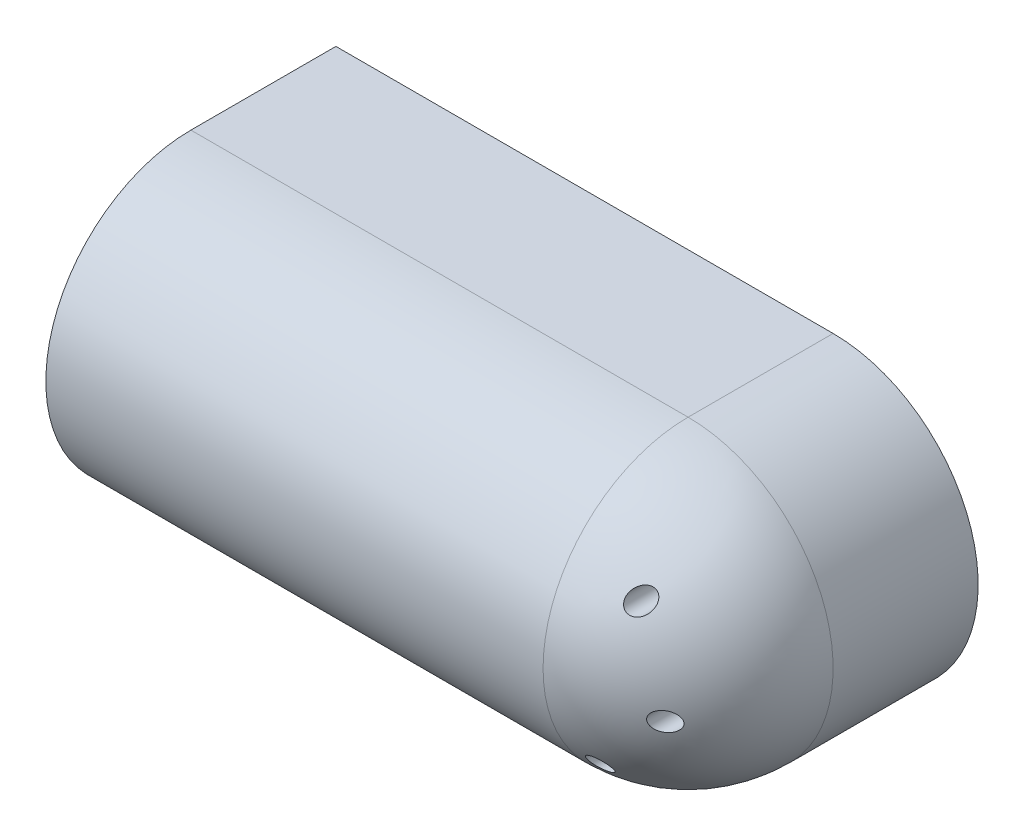
ISO-10303-21;
HEADER;
FILE_DESCRIPTION(('STEP AP214'),'2;1');
FILE_NAME('part.step','',(''),(''),'','','');
FILE_SCHEMA(('AUTOMOTIVE_DESIGN { 1 0 10303 214 1 1 1 1 }'));
ENDSEC;
DATA;
#1=APPLICATION_CONTEXT('core data for automotive mechanical design processes');
#2=APPLICATION_PROTOCOL_DEFINITION('international standard','automotive_design',2000,#1);
#3=PRODUCT_CONTEXT('',#1,'mechanical');
#4=PRODUCT('Part','Part','',(#3));
#5=PRODUCT_RELATED_PRODUCT_CATEGORY('part','',(#4));
#6=PRODUCT_DEFINITION_FORMATION('','',#4);
#7=PRODUCT_DEFINITION_CONTEXT('part definition',#1,'design');
#8=PRODUCT_DEFINITION('design','',#6,#7);
#9=PRODUCT_DEFINITION_SHAPE('','',#8);
#10=(LENGTH_UNIT() NAMED_UNIT(*) SI_UNIT(.MILLI.,.METRE.));
#11=(NAMED_UNIT(*) PLANE_ANGLE_UNIT() SI_UNIT($,.RADIAN.));
#12=(NAMED_UNIT(*) SI_UNIT($,.STERADIAN.) SOLID_ANGLE_UNIT());
#13=UNCERTAINTY_MEASURE_WITH_UNIT(LENGTH_MEASURE(1.E-05),#10,'distance_accuracy_value','');
#14=(GEOMETRIC_REPRESENTATION_CONTEXT(3) GLOBAL_UNCERTAINTY_ASSIGNED_CONTEXT((#13)) GLOBAL_UNIT_ASSIGNED_CONTEXT((#10,
#11,#12)) REPRESENTATION_CONTEXT('',''));
#15=CARTESIAN_POINT('',(0.,0.,0.));
#16=DIRECTION('',(0.,0.,1.));
#17=DIRECTION('',(1.,0.,0.));
#18=AXIS2_PLACEMENT_3D('',#15,#16,#17);
#19=CARTESIAN_POINT('',(0.,0.,-70.));
#20=DIRECTION('',(0.,0.,1.));
#21=DIRECTION('',(1.,0.,0.));
#22=AXIS2_PLACEMENT_3D('',#19,#20,#21);
#23=CYLINDRICAL_SURFACE('',#22,35.);
#24=DIRECTION('',(0.,0.,1.));
#25=VECTOR('',#24,1.);
#26=CARTESIAN_POINT('',(0.,35.,-70.));
#27=LINE('',#26,#25);
#28=CARTESIAN_POINT('',(0.,35.,-70.));
#29=VERTEX_POINT('',#28);
#30=CARTESIAN_POINT('',(0.,35.,-35.));
#31=VERTEX_POINT('',#30);
#32=EDGE_CURVE('E205',#29,#31,#27,.T.);
#33=ORIENTED_EDGE('',*,*,#32,.T.);
#34=CARTESIAN_POINT('',(0.,0.,-35.));
#35=DIRECTION('',(0.,0.,1.));
#36=DIRECTION('',(1.,0.,0.));
#37=AXIS2_PLACEMENT_3D('',#34,#35,#36);
#38=CIRCLE('',#37,35.);
#39=CARTESIAN_POINT('',(0.,-35.,-35.));
#40=VERTEX_POINT('',#39);
#41=EDGE_CURVE('E12',#31,#40,#38,.F.);
#42=ORIENTED_EDGE('',*,*,#41,.T.);
#43=DIRECTION('',(0.,0.,1.));
#44=VECTOR('',#43,1.);
#45=CARTESIAN_POINT('',(0.,-35.,-70.));
#46=LINE('',#45,#44);
#47=CARTESIAN_POINT('',(0.,-35.,-70.));
#48=VERTEX_POINT('',#47);
#49=EDGE_CURVE('E217',#48,#40,#46,.T.);
#50=ORIENTED_EDGE('',*,*,#49,.F.);
#51=CARTESIAN_POINT('',(0.,0.,-70.));
#52=DIRECTION('',(0.,0.,-1.));
#53=DIRECTION('',(-1.,0.,0.));
#54=AXIS2_PLACEMENT_3D('',#51,#52,#53);
#55=CIRCLE('',#54,35.);
#56=EDGE_CURVE('E194',#29,#48,#55,.T.);
#57=ORIENTED_EDGE('',*,*,#56,.F.);
#58=EDGE_LOOP('',(#33,#42,#50,#57));
#59=FACE_BOUND('',#58,.T.);
#60=ADVANCED_FACE('F57',(#59),#23,.T.);
#61=CARTESIAN_POINT('',(-120.,-35.,-70.));
#62=DIRECTION('',(1.,0.,0.));
#63=DIRECTION('',(0.,0.,-1.));
#64=AXIS2_PLACEMENT_3D('',#61,#62,#63);
#65=PLANE('',#64);
#66=DIRECTION('',(0.,0.,1.));
#67=VECTOR('',#66,1.);
#68=CARTESIAN_POINT('',(-120.,-30.,-65.));
#69=LINE('',#68,#67);
#70=CARTESIAN_POINT('',(-120.,-30.,-65.));
#71=VERTEX_POINT('',#70);
#72=CARTESIAN_POINT('',(-120.,-30.,-35.));
#73=VERTEX_POINT('',#72);
#74=EDGE_CURVE('E169',#71,#73,#69,.T.);
#75=ORIENTED_EDGE('',*,*,#74,.F.);
#76=DIRECTION('',(0.,-1.,0.));
#77=VECTOR('',#76,1.);
#78=CARTESIAN_POINT('',(-120.,30.,-65.));
#79=LINE('',#78,#77);
#80=CARTESIAN_POINT('',(-120.,30.,-65.));
#81=VERTEX_POINT('',#80);
#82=EDGE_CURVE('E80',#81,#71,#79,.T.);
#83=ORIENTED_EDGE('',*,*,#82,.F.);
#84=DIRECTION('',(0.,0.,-1.));
#85=VECTOR('',#84,1.);
#86=CARTESIAN_POINT('',(-120.,30.,-35.));
#87=LINE('',#86,#85);
#88=CARTESIAN_POINT('',(-120.,30.,-35.));
#89=VERTEX_POINT('',#88);
#90=EDGE_CURVE('E153',#89,#81,#87,.T.);
#91=ORIENTED_EDGE('',*,*,#90,.F.);
#92=CARTESIAN_POINT('',(-120.,0.,-35.));
#93=DIRECTION('',(-1.,0.,0.));
#94=DIRECTION('',(0.,0.,1.));
#95=AXIS2_PLACEMENT_3D('',#92,#93,#94);
#96=CIRCLE('',#95,30.);
#97=EDGE_CURVE('E157',#73,#89,#96,.T.);
#98=ORIENTED_EDGE('',*,*,#97,.F.);
#99=EDGE_LOOP('',(#75,#83,#91,#98));
#100=FACE_BOUND('',#99,.T.);
#101=DIRECTION('',(0.,0.,1.));
#102=VECTOR('',#101,1.);
#103=CARTESIAN_POINT('',(-120.,-35.,-70.));
#104=LINE('',#103,#102);
#105=CARTESIAN_POINT('',(-120.,-35.,-70.));
#106=VERTEX_POINT('',#105);
#107=CARTESIAN_POINT('',(-120.,-35.,-35.));
#108=VERTEX_POINT('',#107);
#109=EDGE_CURVE('E213',#106,#108,#104,.T.);
#110=ORIENTED_EDGE('',*,*,#109,.T.);
#111=CARTESIAN_POINT('',(-120.,0.,-35.));
#112=DIRECTION('',(-1.,0.,0.));
#113=DIRECTION('',(0.,0.,1.));
#114=AXIS2_PLACEMENT_3D('',#111,#112,#113);
#115=CIRCLE('',#114,35.);
#116=CARTESIAN_POINT('',(-120.,35.,-35.));
#117=VERTEX_POINT('',#116);
#118=EDGE_CURVE('E187',#108,#117,#115,.T.);
#119=ORIENTED_EDGE('',*,*,#118,.T.);
#120=DIRECTION('',(0.,0.,1.));
#121=VECTOR('',#120,1.);
#122=CARTESIAN_POINT('',(-120.,35.,-70.));
#123=LINE('',#122,#121);
#124=CARTESIAN_POINT('',(-120.,35.,-70.));
#125=VERTEX_POINT('',#124);
#126=EDGE_CURVE('E209',#125,#117,#123,.T.);
#127=ORIENTED_EDGE('',*,*,#126,.F.);
#128=DIRECTION('',(0.,1.,0.));
#129=VECTOR('',#128,1.);
#130=CARTESIAN_POINT('',(-120.,-35.,-70.));
#131=LINE('',#130,#129);
#132=EDGE_CURVE('E200',#106,#125,#131,.T.);
#133=ORIENTED_EDGE('',*,*,#132,.F.);
#134=EDGE_LOOP('',(#110,#119,#127,#133));
#135=FACE_BOUND('',#134,.T.);
#136=ADVANCED_FACE('F270',(#100,#135),#65,.F.);
#137=CARTESIAN_POINT('',(0.,35.,-70.));
#138=DIRECTION('',(0.,-1.,0.));
#139=DIRECTION('',(0.,0.,-1.));
#140=AXIS2_PLACEMENT_3D('',#137,#138,#139);
#141=PLANE('',#140);
#142=DIRECTION('',(-1.,0.,0.));
#143=VECTOR('',#142,1.);
#144=CARTESIAN_POINT('',(35.,35.,-35.));
#145=LINE('',#144,#143);
#146=EDGE_CURVE('E191',#31,#117,#145,.T.);
#147=ORIENTED_EDGE('',*,*,#146,.F.);
#148=ORIENTED_EDGE('',*,*,#32,.F.);
#149=DIRECTION('',(1.,0.,0.));
#150=VECTOR('',#149,1.);
#151=CARTESIAN_POINT('',(0.,35.,-70.));
#152=LINE('',#151,#150);
#153=EDGE_CURVE('E88',#125,#29,#152,.T.);
#154=ORIENTED_EDGE('',*,*,#153,.F.);
#155=ORIENTED_EDGE('',*,*,#126,.T.);
#156=EDGE_LOOP('',(#147,#148,#154,#155));
#157=FACE_BOUND('',#156,.T.);
#158=ADVANCED_FACE('F267',(#157),#141,.F.);
#159=CARTESIAN_POINT('',(0.,-35.,-70.));
#160=DIRECTION('',(0.,1.,0.));
#161=DIRECTION('',(0.,0.,1.));
#162=AXIS2_PLACEMENT_3D('',#159,#160,#161);
#163=PLANE('',#162);
#164=ORIENTED_EDGE('',*,*,#49,.T.);
#165=DIRECTION('',(-1.,0.,0.));
#166=VECTOR('',#165,1.);
#167=CARTESIAN_POINT('',(35.,-35.,-35.));
#168=LINE('',#167,#166);
#169=EDGE_CURVE('E178',#40,#108,#168,.T.);
#170=ORIENTED_EDGE('',*,*,#169,.T.);
#171=ORIENTED_EDGE('',*,*,#109,.F.);
#172=DIRECTION('',(-1.,0.,0.));
#173=VECTOR('',#172,1.);
#174=CARTESIAN_POINT('',(0.,-35.,-70.));
#175=LINE('',#174,#173);
#176=EDGE_CURVE('E197',#48,#106,#175,.T.);
#177=ORIENTED_EDGE('',*,*,#176,.F.);
#178=EDGE_LOOP('',(#164,#170,#171,#177));
#179=FACE_BOUND('',#178,.T.);
#180=ADVANCED_FACE('F265',(#179),#163,.F.);
#181=CARTESIAN_POINT('',(0.,0.,-70.));
#182=DIRECTION('',(0.,0.,-1.));
#183=DIRECTION('',(-1.,0.,0.));
#184=AXIS2_PLACEMENT_3D('',#181,#182,#183);
#185=PLANE('',#184);
#186=CARTESIAN_POINT('',(15.0014862201565,17.2448713371146,-70.));
#187=DIRECTION('',(0.,0.,-1.));
#188=DIRECTION('',(-1.,0.,0.));
#189=AXIS2_PLACEMENT_3D('',#186,#187,#188);
#190=CIRCLE('',#189,2.5);
#191=CARTESIAN_POINT('',(12.5014862201565,17.2448713371146,-70.));
#192=VERTEX_POINT('',#191);
#193=EDGE_CURVE('E232',#192,#192,#190,.T.);
#194=ORIENTED_EDGE('',*,*,#193,.F.);
#195=EDGE_LOOP('',(#194));
#196=FACE_BOUND('',#195,.T.);
#197=CARTESIAN_POINT('',(21.5544566211452,-4.27973269928448,-70.));
#198=DIRECTION('',(0.,0.,-1.));
#199=DIRECTION('',(-1.,0.,0.));
#200=AXIS2_PLACEMENT_3D('',#197,#198,#199);
#201=CIRCLE('',#200,2.5);
#202=CARTESIAN_POINT('',(19.0544566211452,-4.27973269928448,-70.));
#203=VERTEX_POINT('',#202);
#204=EDGE_CURVE('E307',#203,#203,#201,.T.);
#205=ORIENTED_EDGE('',*,*,#204,.F.);
#206=EDGE_LOOP('',(#205));
#207=FACE_BOUND('',#206,.T.);
#208=CARTESIAN_POINT('',(6.19008791971696,-20.7170735549877,-70.));
#209=DIRECTION('',(0.,0.,-1.));
#210=DIRECTION('',(-1.,0.,0.));
#211=AXIS2_PLACEMENT_3D('',#208,#209,#210);
#212=CIRCLE('',#211,2.5);
#213=CARTESIAN_POINT('',(3.69008791971696,-20.7170735549877,-70.));
#214=VERTEX_POINT('',#213);
#215=EDGE_CURVE('E160',#214,#214,#212,.T.);
#216=ORIENTED_EDGE('',*,*,#215,.F.);
#217=EDGE_LOOP('',(#216));
#218=FACE_BOUND('',#217,.T.);
#219=ORIENTED_EDGE('',*,*,#56,.T.);
#220=ORIENTED_EDGE('',*,*,#176,.T.);
#221=ORIENTED_EDGE('',*,*,#132,.T.);
#222=ORIENTED_EDGE('',*,*,#153,.T.);
#223=EDGE_LOOP('',(#219,#220,#221,#222));
#224=FACE_BOUND('',#223,.T.);
#225=ADVANCED_FACE('F261',(#196,#207,#218,#224),#185,.T.);
#226=CARTESIAN_POINT('',(35.,0.,-35.));
#227=DIRECTION('',(-1.,0.,0.));
#228=DIRECTION('',(0.,0.,1.));
#229=AXIS2_PLACEMENT_3D('',#226,#227,#228);
#230=CYLINDRICAL_SURFACE('',#229,35.);
#231=ORIENTED_EDGE('',*,*,#169,.F.);
#232=CARTESIAN_POINT('',(0.,0.,-35.));
#233=DIRECTION('',(-1.,0.,0.));
#234=DIRECTION('',(0.,0.,1.));
#235=AXIS2_PLACEMENT_3D('',#232,#233,#234);
#236=CIRCLE('',#235,35.);
#237=EDGE_CURVE('E72',#40,#31,#236,.T.);
#238=ORIENTED_EDGE('',*,*,#237,.T.);
#239=ORIENTED_EDGE('',*,*,#146,.T.);
#240=ORIENTED_EDGE('',*,*,#118,.F.);
#241=EDGE_LOOP('',(#231,#238,#239,#240));
#242=FACE_BOUND('',#241,.T.);
#243=ADVANCED_FACE('F258',(#242),#230,.T.);
#244=CARTESIAN_POINT('',(0.,0.,-35.));
#245=DIRECTION('',(0.,0.,1.));
#246=DIRECTION('',(1.,0.,0.));
#247=AXIS2_PLACEMENT_3D('',#244,#245,#246);
#248=SPHERICAL_SURFACE('',#247,35.);
#249=CARTESIAN_POINT('',(16.7177216384352,19.0627096107371,-10.8726112992619));
#250=CARTESIAN_POINT('',(16.6369406019022,19.1389673469574,-10.8768891254063));
#251=CARTESIAN_POINT('',(16.5506841182577,19.2101310633771,-10.8741200688737));
#252=CARTESIAN_POINT('',(16.3703706708573,19.3397588596841,-10.8546655407115));
#253=CARTESIAN_POINT('',(16.2762939882982,19.3981894027401,-10.8379438660747));
#254=CARTESIAN_POINT('',(16.0843496453957,19.500792091149,-10.7920449396665));
#255=CARTESIAN_POINT('',(15.9865084851713,19.5450486942783,-10.7629439674421));
#256=CARTESIAN_POINT('',(15.7894020264096,19.619807946329,-10.6942345705147));
#257=CARTESIAN_POINT('',(15.690136652396,19.6503098635207,-10.6546255869785));
#258=CARTESIAN_POINT('',(15.4570957822486,19.7068728384462,-10.5512803834504));
#259=CARTESIAN_POINT('',(15.323589173151,19.7275060898687,-10.4839718364856));
#260=CARTESIAN_POINT('',(15.0612335294674,19.7476343268948,-10.3380265896305));
#261=CARTESIAN_POINT('',(14.9323948755719,19.7470847863273,-10.2593663741257));
#262=CARTESIAN_POINT('',(14.6393009521085,19.7242021778325,-10.0663462194846));
#263=CARTESIAN_POINT('',(14.4776748458659,19.6946186810416,-9.9488661594846));
#264=CARTESIAN_POINT('',(14.1691391753418,19.6076944498036,-9.70544654595891));
#265=CARTESIAN_POINT('',(14.0222411128686,19.5503322223553,-9.57950050721264));
#266=CARTESIAN_POINT('',(13.7418810707494,19.4101552964685,-9.32026516252962));
#267=CARTESIAN_POINT('',(13.6087689219823,19.326827999887,-9.18687689043501));
#268=CARTESIAN_POINT('',(13.3613212174082,19.1380404529562,-8.91834367157225));
#269=CARTESIAN_POINT('',(13.2469934818765,19.0325710258665,-8.78319801831562));
#270=CARTESIAN_POINT('',(13.0204760878154,18.7808451568048,-8.48951340697672));
#271=CARTESIAN_POINT('',(12.9123810782656,18.6306639005053,-8.33114562767595));
#272=CARTESIAN_POINT('',(12.7300267336322,18.3056020560566,-8.0201900926389));
#273=CARTESIAN_POINT('',(12.6557478821296,18.1307357909828,-7.86759904970232));
#274=CARTESIAN_POINT('',(12.5614474505212,17.8077255770526,-7.61154373178317));
#275=CARTESIAN_POINT('',(12.5323955742453,17.6642332865036,-7.50551825218881));
#276=CARTESIAN_POINT('',(12.5000935539086,17.3679997720518,-7.30284166203909));
#277=CARTESIAN_POINT('',(12.4968043282934,17.2152729117035,-7.20617657203216));
#278=CARTESIAN_POINT('',(12.5174847373755,16.9366938489423,-7.04501269142688));
#279=CARTESIAN_POINT('',(12.5359091544219,16.8118843996288,-6.97801096916109));
#280=CARTESIAN_POINT('',(12.5932728140751,16.5615399760366,-6.85492787236613));
#281=CARTESIAN_POINT('',(12.6321895720176,16.4360059458008,-6.79883462100135));
#282=CARTESIAN_POINT('',(12.7239115259766,16.2079206475439,-6.70831007330224));
#283=CARTESIAN_POINT('',(12.7735172570847,16.1048934930202,-6.67185155439177));
#284=CARTESIAN_POINT('',(12.8882510095789,15.9041342947453,-6.61046346509561));
#285=CARTESIAN_POINT('',(12.9533712600021,15.8063996300569,-6.58552814125709));
#286=CARTESIAN_POINT('',(13.0985440644407,15.6191713956896,-6.54856648528016));
#287=CARTESIAN_POINT('',(13.1786645337786,15.5297181889584,-6.53660061655147));
#288=CARTESIAN_POINT('',(13.3514188562753,15.3629365449163,-6.52660496354298));
#289=CARTESIAN_POINT('',(13.4440496561521,15.2856051590625,-6.52857178484638));
#290=CARTESIAN_POINT('',(13.6307352209359,15.1512611733276,-6.5455704451095));
#291=CARTESIAN_POINT('',(13.7240786765665,15.0931157731124,-6.55954074924815));
#292=CARTESIAN_POINT('',(13.9157572894083,14.9903148372133,-6.59833868403325));
#293=CARTESIAN_POINT('',(14.0140926960396,14.9456599763532,-6.62316685766018));
#294=CARTESIAN_POINT('',(14.2167134685325,14.8686744297755,-6.68356137531326));
#295=CARTESIAN_POINT('',(14.3210845340365,14.8368588221616,-6.71948987412275));
#296=CARTESIAN_POINT('',(14.5297469765997,14.7874371816929,-6.80015418283752));
#297=CARTESIAN_POINT('',(14.6340382783809,14.7698389647261,-6.8448948203544));
#298=CARTESIAN_POINT('',(14.8825289152753,14.7434416237608,-6.96132738217126));
#299=CARTESIAN_POINT('',(15.025755593774,14.7411076805848,-7.03658993466549));
#300=CARTESIAN_POINT('',(15.3045253410427,14.75935955244,-7.19786073741987));
#301=CARTESIAN_POINT('',(15.4400527830374,14.7799903455497,-7.28388978126093));
#302=CARTESIAN_POINT('',(15.7372177599257,14.8494649415152,-7.48862480715347));
#303=CARTESIAN_POINT('',(15.8957032052223,14.9045358614514,-7.60978574983163));
#304=CARTESIAN_POINT('',(16.1935136188976,15.0412454991207,-7.86010933091103));
#305=CARTESIAN_POINT('',(16.3328277707491,15.1228991282082,-7.98927642729875));
#306=CARTESIAN_POINT('',(16.5925691076617,15.3098199282357,-8.25416248472683));
#307=CARTESIAN_POINT('',(16.7126845339988,15.4154202739588,-8.38995032329931));
#308=CARTESIAN_POINT('',(16.929996636402,15.6461274849129,-8.66337598866163));
#309=CARTESIAN_POINT('',(17.0271787213521,15.7712466851984,-8.80101493466116));
#310=CARTESIAN_POINT('',(17.2103317814023,16.0596739675542,-9.09729142271478));
#311=CARTESIAN_POINT('',(17.2920271611415,16.2258894808689,-9.25576847332662));
#312=CARTESIAN_POINT('',(17.4179517101338,16.5774100391062,-9.56649312815749));
#313=CARTESIAN_POINT('',(17.4622136241054,16.762698240795,-9.71874606568845));
#314=CARTESIAN_POINT('',(17.5003056855584,17.0895586449526,-9.96572623504253));
#315=CARTESIAN_POINT('',(17.5053849334559,17.2272723957385,-10.0638582017625));
#316=CARTESIAN_POINT('',(17.491555354038,17.5080009806501,-10.2503797087317));
#317=CARTESIAN_POINT('',(17.4726889647809,17.6510060016036,-10.3387861837088));
#318=CARTESIAN_POINT('',(17.4151852771862,17.9059214663727,-10.4825332997744));
#319=CARTESIAN_POINT('',(17.3820915044804,18.0174209103658,-10.5408028648444));
#320=CARTESIAN_POINT('',(17.2982629848717,18.2392675004891,-10.6460272108515));
#321=CARTESIAN_POINT('',(17.2475404960775,18.3496153925743,-10.6929898157608));
#322=CARTESIAN_POINT('',(17.1375350514195,18.5479416373851,-10.765921403382));
#323=CARTESIAN_POINT('',(17.0809899410568,18.6366371835477,-10.7940634267483));
#324=CARTESIAN_POINT('',(16.9555054255901,18.8078801321939,-10.838332679064));
#325=CARTESIAN_POINT('',(16.8866036211337,18.8904451406456,-10.8544956143251));
#326=CARTESIAN_POINT('',(16.7970179055674,18.9845737961518,-10.866068532906));
#327=CARTESIAN_POINT('',(16.7814702081705,19.0004772253129,-10.867768024523));
#328=CARTESIAN_POINT('',(16.7499291384741,19.0318920968737,-10.8706101461072));
#329=CARTESIAN_POINT('',(16.7339356828557,19.0474034649441,-10.8717526712211));
#330=CARTESIAN_POINT('',(16.7177216384352,19.0627096107371,-10.8726112992619));
#331=B_SPLINE_CURVE_WITH_KNOTS('',3,(#249,#250,#251,#252,#253,#254,#255,#256,#257,#258,#259,
#260,#261,#262,#263,#264,#265,#266,#267,#268,#269,#270,#271,#272,#273,#274,#275,#276,#277,#278,
#279,#280,#281,#282,#283,#284,#285,#286,#287,#288,#289,#290,#291,#292,#293,#294,#295,#296,#297,
#298,#299,#300,#301,#302,#303,#304,#305,#306,#307,#308,#309,#310,#311,#312,#313,#314,#315,#316,
#317,#318,#319,#320,#321,#322,#323,#324,#325,#326,#327,#328,#329,#330),.UNSPECIFIED.,.T.,.F.,(4,
2,2,2,2,2,2,2,2,2,2,2,2,2,2,2,2,2,2,2,2,2,2,2,2,2,2,2,2,2,2,2,2,2,2,2,2,2,2,2,4),(0.,
0.333412729087982,0.667693267732511,0.999943189629446,1.33221078466303,1.78252625151649,
2.23378833176974,2.83653127278071,3.43974131587568,4.05570762185967,4.67192971901068,
5.39915113544319,6.12595231471861,6.66631644424822,7.20586069043455,7.63281126519433,
8.05929435318566,8.41784734901343,8.77622112783298,9.13625854754588,9.49620825447466,
9.82726121831297,10.1583307393454,10.5016064138716,10.8450706730731,11.3278613329314,
11.8115992391924,12.4291911805736,13.0471301537766,13.6742606917862,14.301789166184,
15.0296325291327,15.7568385546304,16.2627155352197,16.7676972174319,17.1565653385638,
17.5451635998749,17.8705002224607,18.1948631639044,18.2617718333065,18.3286930939366),.UNSPECIFIED.);
#332=CARTESIAN_POINT('',(16.7177216384352,19.0627096107371,-10.8726112992619));
#333=VERTEX_POINT('',#332);
#334=EDGE_CURVE('E62',#333,#333,#331,.T.);
#335=ORIENTED_EDGE('',*,*,#334,.F.);
#336=EDGE_LOOP('',(#335));
#337=FACE_BOUND('',#336,.T.);
#338=CARTESIAN_POINT('',(23.3832848355082,-5.98425238598531,-9.65417758915049));
#339=CARTESIAN_POINT('',(23.4568986323955,-5.90526464716925,-9.70344273240122));
#340=CARTESIAN_POINT('',(23.5267315165937,-5.82007060811399,-9.74858865868272));
#341=CARTESIAN_POINT('',(23.6564030840938,-5.6377944034859,-9.82850842365398));
#342=CARTESIAN_POINT('',(23.7162342347565,-5.5407033724095,-9.86327446025336));
#343=CARTESIAN_POINT('',(23.8235225321215,-5.33557578116255,-9.92041266444247));
#344=CARTESIAN_POINT('',(23.8708970502679,-5.22747242045602,-9.94270312568407));
#345=CARTESIAN_POINT('',(23.9502158351547,-5.00387053783963,-9.97276050131583));
#346=CARTESIAN_POINT('',(23.9821742031761,-4.88837888402702,-9.9805407071042));
#347=CARTESIAN_POINT('',(24.0271386488118,-4.66415600588351,-9.9809235289508));
#348=CARTESIAN_POINT('',(24.0415441081609,-4.55570328478754,-9.97477989581733));
#349=CARTESIAN_POINT('',(24.0561021936478,-4.33923560368691,-9.95031139194295));
#350=CARTESIAN_POINT('',(24.0562529479992,-4.23122070303458,-9.93198492179091));
#351=CARTESIAN_POINT('',(24.0431364410614,-4.01978227454172,-9.88465437170701));
#352=CARTESIAN_POINT('',(24.0300242417079,-3.91632010956318,-9.85577614900134));
#353=CARTESIAN_POINT('',(23.991933816198,-3.71471077003327,-9.78889730039799));
#354=CARTESIAN_POINT('',(23.9669503136153,-3.61656598052085,-9.75089262179236));
#355=CARTESIAN_POINT('',(23.8942424483441,-3.38807150340859,-9.65026146562968));
#356=CARTESIAN_POINT('',(23.8413959101901,-3.26097674267265,-9.58392334041818));
#357=CARTESIAN_POINT('',(23.7191022699311,-3.02178230073832,-9.44033780227928));
#358=CARTESIAN_POINT('',(23.6496207834094,-2.90971443866367,-9.36306793059073));
#359=CARTESIAN_POINT('',(23.4750665363999,-2.67065885325035,-9.17699374410195));
#360=CARTESIAN_POINT('',(23.3655339471925,-2.54895490587737,-9.06559271205467));
#361=CARTESIAN_POINT('',(23.1299483988107,-2.33203937504111,-8.83502133660282));
#362=CARTESIAN_POINT('',(23.0038854041201,-2.23684399533249,-8.71584629590742));
#363=CARTESIAN_POINT('',(22.7372094122734,-2.07154791464179,-8.47137103418457));
#364=CARTESIAN_POINT('',(22.5963962756143,-2.00187205973618,-8.34600340458545));
#365=CARTESIAN_POINT('',(22.3053512353298,-1.89007308785599,-8.09388239137973));
#366=CARTESIAN_POINT('',(22.1551153256026,-1.84796177818936,-7.96712843754443));
#367=CARTESIAN_POINT('',(21.825305908272,-1.78798623210344,-7.69592898624227));
#368=CARTESIAN_POINT('',(21.644712286029,-1.77470706992499,-7.55168200173921));
#369=CARTESIAN_POINT('',(21.2803028597333,-1.7881413183448,-7.26907202417079));
#370=CARTESIAN_POINT('',(21.0964891381724,-1.81482976099172,-7.13070541312754));
#371=CARTESIAN_POINT('',(20.7768126610049,-1.8994954998487,-6.89757386565656));
#372=CARTESIAN_POINT('',(20.6402230698996,-1.94821798973334,-6.80042492951446));
#373=CARTESIAN_POINT('',(20.3727349058833,-2.07175715981126,-6.61532745509851));
#374=CARTESIAN_POINT('',(20.2418277477238,-2.1465328167203,-6.52736473358722));
#375=CARTESIAN_POINT('',(20.0147996178292,-2.30619144527171,-6.37991866188575));
#376=CARTESIAN_POINT('',(19.9168240022822,-2.38638093955888,-6.31820943176552));
#377=CARTESIAN_POINT('',(19.7311141895346,-2.56453187814992,-6.20545231101419));
#378=CARTESIAN_POINT('',(19.6433777083929,-2.66248934663013,-6.1544020407833));
#379=CARTESIAN_POINT('',(19.5222087129668,-2.82216210555186,-6.08765286772663));
#380=CARTESIAN_POINT('',(19.4833926683808,-2.87781654764309,-6.06696330485625));
#381=CARTESIAN_POINT('',(19.4099401039895,-2.99299094950146,-6.02930378264428));
#382=CARTESIAN_POINT('',(19.3753013088458,-3.05250877746389,-6.01233179419756));
#383=CARTESIAN_POINT('',(19.3107338320907,-3.17497263644687,-5.98241706148069));
#384=CARTESIAN_POINT('',(19.2808022691514,-3.23791653832978,-5.96947184761179));
#385=CARTESIAN_POINT('',(19.2261002770415,-3.36668376266609,-5.94784819387717));
#386=CARTESIAN_POINT('',(19.2013288718525,-3.43250653773986,-5.93916894670196));
#387=CARTESIAN_POINT('',(19.1418226039918,-3.6137036292263,-5.9217209824732));
#388=CARTESIAN_POINT('',(19.1123681601358,-3.73130895405418,-5.91719941433649));
#389=CARTESIAN_POINT('',(19.0708751797368,-3.96921756486335,-5.92145758569896));
#390=CARTESIAN_POINT('',(19.0588303247366,-4.08951985592975,-5.93023249714093));
#391=CARTESIAN_POINT('',(19.0522981530589,-4.32091356577137,-5.95947098807926));
#392=CARTESIAN_POINT('',(19.0566876873504,-4.43208170149135,-5.97911133959109));
#393=CARTESIAN_POINT('',(19.0796773312024,-4.6506084725652,-6.02845465043839));
#394=CARTESIAN_POINT('',(19.0982793672219,-4.75796658941867,-6.0581589736091));
#395=CARTESIAN_POINT('',(19.1499583106728,-4.97362690097754,-6.12862058124848));
#396=CARTESIAN_POINT('',(19.183914526774,-5.08151823091501,-6.16998093135641));
#397=CARTESIAN_POINT('',(19.2644011129965,-5.28870115549737,-6.26105543055088));
#398=CARTESIAN_POINT('',(19.3109373867782,-5.3879886835254,-6.3107734976542));
#399=CARTESIAN_POINT('',(19.4228377344136,-5.59190206158757,-6.42547684504495));
#400=CARTESIAN_POINT('',(19.4900187728895,-5.694867736346,-6.49163271286428));
#401=CARTESIAN_POINT('',(19.6357739566113,-5.8869727229933,-6.63101401799006));
#402=CARTESIAN_POINT('',(19.714355203027,-5.9761033448915,-6.70424385208726));
#403=CARTESIAN_POINT('',(19.8977361594636,-6.15727021712846,-6.87178707506295));
#404=CARTESIAN_POINT('',(20.0045955939684,-6.24608678551926,-6.96732639419381));
#405=CARTESIAN_POINT('',(20.2279785171888,-6.40320418773942,-7.16376079794539));
#406=CARTESIAN_POINT('',(20.3445079721231,-6.47149223395292,-7.26465917497706));
#407=CARTESIAN_POINT('',(20.6089092556272,-6.59957704126014,-7.49074000389133));
#408=CARTESIAN_POINT('',(20.7583372496213,-6.6548263098106,-7.61668973852665));
#409=CARTESIAN_POINT('',(21.0633685871883,-6.73610854882345,-7.87067150087439));
#410=CARTESIAN_POINT('',(21.2189777391934,-6.76211333202976,-7.99870541707863));
#411=CARTESIAN_POINT('',(21.5534699482028,-6.78606102827063,-8.27080615944806));
#412=CARTESIAN_POINT('',(21.7327373393155,-6.77989328378675,-8.41478197657809));
#413=CARTESIAN_POINT('',(22.0899490812281,-6.72836265945759,-8.69760911285431));
#414=CARTESIAN_POINT('',(22.2678935881394,-6.68300448091101,-8.83646104458049));
#415=CARTESIAN_POINT('',(22.5724406175342,-6.56734296382467,-9.06962380590164));
#416=CARTESIAN_POINT('',(22.7006911913423,-6.50619367715025,-9.16634801310171));
#417=CARTESIAN_POINT('',(22.9493622899713,-6.35938447296584,-9.35016417461938));
#418=CARTESIAN_POINT('',(23.0698120819151,-6.27382357245917,-9.43729310897621));
#419=CARTESIAN_POINT('',(23.2529358645031,-6.11641844255716,-9.56575126461416));
#420=CARTESIAN_POINT('',(23.3195284147878,-6.0526631421296,-9.61150937568021));
#421=CARTESIAN_POINT('',(23.3832848355082,-5.98425238598531,-9.65417758915049));
#422=B_SPLINE_CURVE_WITH_KNOTS('',3,(#338,#339,#340,#341,#342,#343,#344,#345,#346,#347,#348,
#349,#350,#351,#352,#353,#354,#355,#356,#357,#358,#359,#360,#361,#362,#363,#364,#365,#366,#367,
#368,#369,#370,#371,#372,#373,#374,#375,#376,#377,#378,#379,#380,#381,#382,#383,#384,#385,#386,
#387,#388,#389,#390,#391,#392,#393,#394,#395,#396,#397,#398,#399,#400,#401,#402,#403,#404,#405,
#406,#407,#408,#409,#410,#411,#412,#413,#414,#415,#416,#417,#418,#419,#420,#421),.UNSPECIFIED.,
.T.,.F.,(4,2,2,2,2,2,2,2,2,2,2,2,2,2,2,2,2,2,2,2,2,2,2,2,2,2,2,2,2,2,2,2,2,2,2,2,2,2,2,2,2,4),
(0.,0.355800218213375,0.711867205821224,1.07023968443908,1.42828373222738,1.75538019539802,
2.08251960957167,2.40587802809755,2.72938030404933,3.18525535595666,3.64208096235663,
4.23306548229608,4.82441046123476,5.42519512807445,6.02623697367132,6.71744338767872,
7.40821818186396,7.92995460719071,8.45087319224336,8.8718244875438,9.29268170526008,
9.50522362412155,9.71764924389132,9.92994432615662,10.1421992173236,10.5040312848711,
10.865731999805,11.2031791805007,11.5406721091954,11.9005799899784,12.2606570650265,
12.677971027087,13.0955460583643,13.5995835497114,14.1039343683019,14.7108031338142,
15.3182563289438,16.0050817804666,16.6918248515962,17.2056890589722,17.7174978898591,
18.0256540964947),.UNSPECIFIED.);
#423=CARTESIAN_POINT('',(23.3832848355082,-5.98425238598531,-9.65417758915049));
#424=VERTEX_POINT('',#423);
#425=EDGE_CURVE('E231',#424,#424,#422,.T.);
#426=ORIENTED_EDGE('',*,*,#425,.F.);
#427=EDGE_LOOP('',(#426));
#428=FACE_BOUND('',#427,.T.);
#429=CARTESIAN_POINT('',(4.80477897625525,-22.7981596010634,-8.88184505379873));
#430=CARTESIAN_POINT('',(4.91176072089829,-22.8693727276767,-8.9636878948358));
#431=CARTESIAN_POINT('',(5.02616797550248,-22.933634662253,-9.04216318083688));
#432=CARTESIAN_POINT('',(5.26903001503907,-23.0450550380967,-9.1894198857896));
#433=CARTESIAN_POINT('',(5.39749459308957,-23.092201455737,-9.25819446935212));
#434=CARTESIAN_POINT('',(5.64191239519249,-23.1588936520624,-9.37091429470456));
#435=CARTESIAN_POINT('',(5.75587203481312,-23.181905742666,-9.41710028176519));
#436=CARTESIAN_POINT('',(5.98981443609058,-23.2118203108313,-9.49805820671494));
#437=CARTESIAN_POINT('',(6.10979121943476,-23.218738466794,-9.53284122474702));
#438=CARTESIAN_POINT('',(6.3536501413465,-23.2147153404951,-9.58890214405));
#439=CARTESIAN_POINT('',(6.4775551468135,-23.2036369220931,-9.6100746123182));
#440=CARTESIAN_POINT('',(6.72392913392064,-23.1625941781686,-9.636665134092));
#441=CARTESIAN_POINT('',(6.84639898255503,-23.1326419247916,-9.64209324563009));
#442=CARTESIAN_POINT('',(7.07006192614793,-23.0596631047217,-9.63706967355938));
#443=CARTESIAN_POINT('',(7.17199800525602,-23.0187454515604,-9.62852282320079));
#444=CARTESIAN_POINT('',(7.36826504407237,-22.9247279103159,-9.59965422390896));
#445=CARTESIAN_POINT('',(7.46259600336977,-22.8716280215747,-9.57933247433959));
#446=CARTESIAN_POINT('',(7.64182502393684,-22.755189868956,-9.5281341372396));
#447=CARTESIAN_POINT('',(7.72670037402694,-22.691827814954,-9.49723283378727));
#448=CARTESIAN_POINT('',(7.88567870423217,-22.5571406855465,-9.42650585842105));
#449=CARTESIAN_POINT('',(7.95977636106558,-22.485811705685,-9.386675800961));
#450=CARTESIAN_POINT('',(8.12506784218275,-22.3064838785372,-9.28175421900615));
#451=CARTESIAN_POINT('',(8.21071573755862,-22.195490707252,-9.21301793439587));
#452=CARTESIAN_POINT('',(8.36009850227372,-21.9660269459488,-9.06495122398831));
#453=CARTESIAN_POINT('',(8.42378804696279,-21.8475414801055,-8.98559934914417));
#454=CARTESIAN_POINT('',(8.54489303873601,-21.5732934094822,-8.79661854643302));
#455=CARTESIAN_POINT('',(8.5957607706963,-21.4162439838829,-8.6846662979931));
#456=CARTESIAN_POINT('',(8.66579752123782,-21.1005412916651,-8.4536124344029));
#457=CARTESIAN_POINT('',(8.68495010637259,-20.9418872364033,-8.33450714595028));
#458=CARTESIAN_POINT('',(8.69347607886852,-20.6245379598209,-8.09103432962632));
#459=CARTESIAN_POINT('',(8.68244893797369,-20.4658704041057,-7.96661780819619));
#460=CARTESIAN_POINT('',(8.63097337479626,-20.1539799282141,-7.71696508861364));
#461=CARTESIAN_POINT('',(8.59051096214236,-20.0007596334161,-7.59172852876292));
#462=CARTESIAN_POINT('',(8.47383112236643,-19.6843903309956,-7.327442262841));
#463=CARTESIAN_POINT('',(8.39373949056747,-19.522435725196,-7.188648339945));
#464=CARTESIAN_POINT('',(8.19731510325598,-19.2156957660362,-6.91775563827072));
#465=CARTESIAN_POINT('',(8.08101394769902,-19.0708955935738,-6.78565113807491));
#466=CARTESIAN_POINT('',(7.84761095506466,-18.8403424884571,-6.56613315737185));
#467=CARTESIAN_POINT('',(7.73853589377855,-18.7490143247135,-6.47601333477139));
#468=CARTESIAN_POINT('',(7.50152397935219,-18.5837837990943,-6.30508454709981));
#469=CARTESIAN_POINT('',(7.3736159676694,-18.5098552329058,-6.22426167563006));
#470=CARTESIAN_POINT('',(7.12540104936373,-18.3953581599834,-6.08878460263935));
#471=CARTESIAN_POINT('',(7.00790250290658,-18.3511745215479,-6.03204121416336));
#472=CARTESIAN_POINT('',(6.76312574619846,-18.2803139905003,-5.92924041273304));
#473=CARTESIAN_POINT('',(6.6358501726513,-18.2536323962612,-5.88318013209409));
#474=CARTESIAN_POINT('',(6.43960966816076,-18.2286683079435,-5.82377853451997));
#475=CARTESIAN_POINT('',(6.37299646327206,-18.2228650493382,-5.80553292487154));
#476=CARTESIAN_POINT('',(6.23864989267983,-18.2166427934938,-5.7726505647151));
#477=CARTESIAN_POINT('',(6.17091712952813,-18.2162209887123,-5.75801193632927));
#478=CARTESIAN_POINT('',(6.03494923464397,-18.220965424077,-5.7326018711905));
#479=CARTESIAN_POINT('',(5.96671435336081,-18.2261290441164,-5.72182862435398));
#480=CARTESIAN_POINT('',(5.83041542060173,-18.2421286910466,-5.70433842219638));
#481=CARTESIAN_POINT('',(5.76235134369378,-18.2529638160791,-5.69762082232933));
#482=CARTESIAN_POINT('',(5.57760808286329,-18.2903297632684,-5.68501366865913));
#483=CARTESIAN_POINT('',(5.46171021072718,-18.3225444086431,-5.68330818651327));
#484=CARTESIAN_POINT('',(5.23629506869443,-18.4030676643158,-5.69261739825622));
#485=CARTESIAN_POINT('',(5.12677603181099,-18.4513717925521,-5.70362855176562));
#486=CARTESIAN_POINT('',(4.92249396067067,-18.5593249958892,-5.73682455702196));
#487=CARTESIAN_POINT('',(4.82726588787118,-18.6182816194176,-5.75841982560675));
#488=CARTESIAN_POINT('',(4.64730515511058,-18.7467795033464,-5.81141064811355));
#489=CARTESIAN_POINT('',(4.56257431273081,-18.8163225921459,-5.84280789593157));
#490=CARTESIAN_POINT('',(4.39883631598202,-18.9692480084365,-5.91679507272862));
#491=CARTESIAN_POINT('',(4.32073806969763,-19.0532776550709,-5.96004890395925));
#492=CARTESIAN_POINT('',(4.17857766582961,-19.2282634103581,-6.05473534489468));
#493=CARTESIAN_POINT('',(4.11452227992819,-19.3192228322917,-6.1061718798848));
#494=CARTESIAN_POINT('',(3.99125192505925,-19.5207389867334,-6.22447602480168));
#495=CARTESIAN_POINT('',(3.9344620119517,-19.6320986730791,-6.29249538535033));
#496=CARTESIAN_POINT('',(3.83907315509604,-19.8581189771414,-6.4353921951667));
#497=CARTESIAN_POINT('',(3.8004859564366,-19.9727816756056,-6.51027403526213));
#498=CARTESIAN_POINT('',(3.73454399733868,-20.2264010508944,-6.68083718432868));
#499=CARTESIAN_POINT('',(3.71103272425907,-20.365586395886,-6.77766449937955));
#500=CARTESIAN_POINT('',(3.68734527694271,-20.6423092393901,-6.97630009755919));
#501=CARTESIAN_POINT('',(3.68718008076915,-20.7798459322595,-7.07811070147869));
#502=CARTESIAN_POINT('',(3.71080292885734,-21.0767026774942,-7.304443927526));
#503=CARTESIAN_POINT('',(3.73915715004452,-21.2351849272988,-7.4296004037423));
#504=CARTESIAN_POINT('',(3.82508335959627,-21.5431225154107,-7.68143277860725));
#505=CARTESIAN_POINT('',(3.88270612362261,-21.6925616596397,-7.80811094296805));
#506=CARTESIAN_POINT('',(4.0339779259676,-21.9949321514428,-8.07415144264569));
#507=CARTESIAN_POINT('',(4.13094875960789,-22.146367477751,-8.21333875994388));
#508=CARTESIAN_POINT('',(4.35829831388553,-22.4279507001238,-8.48503982868403));
#509=CARTESIAN_POINT('',(4.48854397775843,-22.5581800733586,-8.61757770094115));
#510=CARTESIAN_POINT('',(4.68927671531364,-22.7176724297179,-8.79074347798777));
#511=CARTESIAN_POINT('',(4.74590337642231,-22.7589686572316,-8.83680422581292));
#512=CARTESIAN_POINT('',(4.80477897625525,-22.7981596010634,-8.88184505379873));
#513=B_SPLINE_CURVE_WITH_KNOTS('',3,(#429,#430,#431,#432,#433,#434,#435,#436,#437,#438,#439,
#440,#441,#442,#443,#444,#445,#446,#447,#448,#449,#450,#451,#452,#453,#454,#455,#456,#457,#458,
#459,#460,#461,#462,#463,#464,#465,#466,#467,#468,#469,#470,#471,#472,#473,#474,#475,#476,#477,
#478,#479,#480,#481,#482,#483,#484,#485,#486,#487,#488,#489,#490,#491,#492,#493,#494,#495,#496,
#497,#498,#499,#500,#501,#502,#503,#504,#505,#506,#507,#508,#509,#510,#511,#512),.UNSPECIFIED.,
.T.,.F.,(4,2,2,2,2,2,2,2,2,2,2,2,2,2,2,2,2,2,2,2,2,2,2,2,2,2,2,2,2,2,2,2,2,2,2,2,2,2,2,2,2,4),
(0.,0.456902185360468,0.914124725585642,1.28792765499223,1.66136628001931,2.03766392576166,
2.41372112672067,2.74265015625969,3.07157920356864,3.40128199768937,3.73114708851037,
4.1970059793364,4.66382078086079,5.25907537684317,5.85463831215474,6.45814341146517,
7.06193553993835,7.74207626022088,8.42162507941446,8.92497269870377,9.42755734007603,
9.83925516260899,10.2508423441693,10.4585128481475,10.6660750045271,10.8735398363057,
11.080971687935,11.4398246772098,11.7985777839714,12.139294754732,12.4800706379702,
12.8464605102239,13.2130266745469,13.6383990857388,14.06404558935,14.5756730482633,
15.0875410897776,15.6968579626948,16.3072355197114,16.9862310028988,17.6625527469868,
17.9140011629557),.UNSPECIFIED.);
#514=CARTESIAN_POINT('',(4.80477897625525,-22.7981596010634,-8.88184505379873));
#515=VERTEX_POINT('',#514);
#516=EDGE_CURVE('E224',#515,#515,#513,.T.);
#517=ORIENTED_EDGE('',*,*,#516,.F.);
#518=EDGE_LOOP('',(#517));
#519=FACE_BOUND('',#518,.T.);
#520=ORIENTED_EDGE('',*,*,#237,.F.);
#521=ORIENTED_EDGE('',*,*,#41,.F.);
#522=EDGE_LOOP('',(#520,#521));
#523=FACE_BOUND('',#522,.T.);
#524=ADVANCED_FACE('F59',(#337,#428,#519,#523),#248,.T.);
#525=CARTESIAN_POINT('',(0.,30.,-65.));
#526=DIRECTION('',(0.,0.,-1.));
#527=DIRECTION('',(-1.,0.,0.));
#528=AXIS2_PLACEMENT_3D('',#525,#526,#527);
#529=PLANE('',#528);
#530=ORIENTED_EDGE('',*,*,#82,.T.);
#531=DIRECTION('',(-1.,0.,0.));
#532=VECTOR('',#531,1.);
#533=CARTESIAN_POINT('',(0.,-30.,-65.));
#534=LINE('',#533,#532);
#535=CARTESIAN_POINT('',(0.,-30.,-65.));
#536=VERTEX_POINT('',#535);
#537=EDGE_CURVE('E128',#536,#71,#534,.T.);
#538=ORIENTED_EDGE('',*,*,#537,.F.);
#539=DIRECTION('',(0.,-1.,0.));
#540=VECTOR('',#539,1.);
#541=CARTESIAN_POINT('',(0.,30.,-65.));
#542=LINE('',#541,#540);
#543=CARTESIAN_POINT('',(0.,30.,-65.));
#544=VERTEX_POINT('',#543);
#545=EDGE_CURVE('E132',#544,#536,#542,.T.);
#546=ORIENTED_EDGE('',*,*,#545,.F.);
#547=DIRECTION('',(-1.,0.,0.));
#548=VECTOR('',#547,1.);
#549=CARTESIAN_POINT('',(0.,30.,-65.));
#550=LINE('',#549,#548);
#551=EDGE_CURVE('E175',#544,#81,#550,.T.);
#552=ORIENTED_EDGE('',*,*,#551,.T.);
#553=EDGE_LOOP('',(#530,#538,#546,#552));
#554=FACE_BOUND('',#553,.T.);
#555=ADVANCED_FACE('F130',(#554),#529,.F.);
#556=CARTESIAN_POINT('',(0.,30.,-35.));
#557=DIRECTION('',(0.,1.,0.));
#558=DIRECTION('',(0.,0.,1.));
#559=AXIS2_PLACEMENT_3D('',#556,#557,#558);
#560=PLANE('',#559);
#561=ORIENTED_EDGE('',*,*,#90,.T.);
#562=ORIENTED_EDGE('',*,*,#551,.F.);
#563=DIRECTION('',(0.,0.,-1.));
#564=VECTOR('',#563,1.);
#565=CARTESIAN_POINT('',(0.,30.,-35.));
#566=LINE('',#565,#564);
#567=CARTESIAN_POINT('',(0.,30.,-35.));
#568=VERTEX_POINT('',#567);
#569=EDGE_CURVE('E139',#568,#544,#566,.T.);
#570=ORIENTED_EDGE('',*,*,#569,.F.);
#571=DIRECTION('',(-1.,0.,0.));
#572=VECTOR('',#571,1.);
#573=CARTESIAN_POINT('',(0.,30.,-35.));
#574=LINE('',#573,#572);
#575=EDGE_CURVE('E179',#568,#89,#574,.T.);
#576=ORIENTED_EDGE('',*,*,#575,.T.);
#577=EDGE_LOOP('',(#561,#562,#570,#576));
#578=FACE_BOUND('',#577,.T.);
#579=ADVANCED_FACE('F246',(#578),#560,.F.);
#580=CARTESIAN_POINT('',(0.,0.,-35.));
#581=DIRECTION('',(-1.,0.,0.));
#582=DIRECTION('',(0.,0.,1.));
#583=AXIS2_PLACEMENT_3D('',#580,#581,#582);
#584=CYLINDRICAL_SURFACE('',#583,30.);
#585=ORIENTED_EDGE('',*,*,#97,.T.);
#586=ORIENTED_EDGE('',*,*,#575,.F.);
#587=CARTESIAN_POINT('',(0.,0.,-35.));
#588=DIRECTION('',(-1.,0.,0.));
#589=DIRECTION('',(0.,0.,1.));
#590=AXIS2_PLACEMENT_3D('',#587,#588,#589);
#591=CIRCLE('',#590,30.);
#592=CARTESIAN_POINT('',(0.,-30.,-35.));
#593=VERTEX_POINT('',#592);
#594=EDGE_CURVE('E148',#593,#568,#591,.T.);
#595=ORIENTED_EDGE('',*,*,#594,.F.);
#596=DIRECTION('',(-1.,0.,0.));
#597=VECTOR('',#596,1.);
#598=CARTESIAN_POINT('',(0.,-30.,-35.));
#599=LINE('',#598,#597);
#600=EDGE_CURVE('E138',#593,#73,#599,.T.);
#601=ORIENTED_EDGE('',*,*,#600,.T.);
#602=EDGE_LOOP('',(#585,#586,#595,#601));
#603=FACE_BOUND('',#602,.T.);
#604=ADVANCED_FACE('F249',(#603),#584,.F.);
#605=CARTESIAN_POINT('',(0.,-30.,-65.));
#606=DIRECTION('',(0.,-1.,0.));
#607=DIRECTION('',(0.,0.,-1.));
#608=AXIS2_PLACEMENT_3D('',#605,#606,#607);
#609=PLANE('',#608);
#610=ORIENTED_EDGE('',*,*,#74,.T.);
#611=ORIENTED_EDGE('',*,*,#600,.F.);
#612=DIRECTION('',(0.,0.,1.));
#613=VECTOR('',#612,1.);
#614=CARTESIAN_POINT('',(0.,-30.,-65.));
#615=LINE('',#614,#613);
#616=EDGE_CURVE('E142',#536,#593,#615,.T.);
#617=ORIENTED_EDGE('',*,*,#616,.F.);
#618=ORIENTED_EDGE('',*,*,#537,.T.);
#619=EDGE_LOOP('',(#610,#611,#617,#618));
#620=FACE_BOUND('',#619,.T.);
#621=ADVANCED_FACE('F143',(#620),#609,.F.);
#622=CARTESIAN_POINT('',(0.,0.,-35.));
#623=DIRECTION('',(-1.,0.,0.));
#624=DIRECTION('',(0.,0.,1.));
#625=AXIS2_PLACEMENT_3D('',#622,#623,#624);
#626=PLANE('',#625);
#627=ORIENTED_EDGE('',*,*,#545,.T.);
#628=ORIENTED_EDGE('',*,*,#616,.T.);
#629=ORIENTED_EDGE('',*,*,#594,.T.);
#630=ORIENTED_EDGE('',*,*,#569,.T.);
#631=EDGE_LOOP('',(#627,#628,#629,#630));
#632=FACE_BOUND('',#631,.T.);
#633=ADVANCED_FACE('F150',(#632),#626,.T.);
#634=CARTESIAN_POINT('',(6.19008791971696,-20.7170735549877,0.001000000000001));
#635=DIRECTION('',(0.,0.,-1.));
#636=DIRECTION('',(-1.,0.,0.));
#637=AXIS2_PLACEMENT_3D('',#634,#635,#636);
#638=CYLINDRICAL_SURFACE('',#637,2.5);
#639=ORIENTED_EDGE('',*,*,#516,.T.);
#640=EDGE_LOOP('',(#639));
#641=FACE_BOUND('',#640,.T.);
#642=ORIENTED_EDGE('',*,*,#215,.T.);
#643=EDGE_LOOP('',(#642));
#644=FACE_BOUND('',#643,.T.);
#645=ADVANCED_FACE('F237',(#641,#644),#638,.F.);
#646=CARTESIAN_POINT('',(21.5544566211452,-4.27973269928448,0.001000000000001));
#647=DIRECTION('',(0.,0.,-1.));
#648=DIRECTION('',(-1.,0.,0.));
#649=AXIS2_PLACEMENT_3D('',#646,#647,#648);
#650=CYLINDRICAL_SURFACE('',#649,2.5);
#651=ORIENTED_EDGE('',*,*,#425,.T.);
#652=EDGE_LOOP('',(#651));
#653=FACE_BOUND('',#652,.T.);
#654=ORIENTED_EDGE('',*,*,#204,.T.);
#655=EDGE_LOOP('',(#654));
#656=FACE_BOUND('',#655,.T.);
#657=ADVANCED_FACE('F241',(#653,#656),#650,.F.);
#658=CARTESIAN_POINT('',(15.0014862201565,17.2448713371146,0.001000000000001));
#659=DIRECTION('',(0.,0.,-1.));
#660=DIRECTION('',(-1.,0.,0.));
#661=AXIS2_PLACEMENT_3D('',#658,#659,#660);
#662=CYLINDRICAL_SURFACE('',#661,2.5);
#663=ORIENTED_EDGE('',*,*,#334,.T.);
#664=EDGE_LOOP('',(#663));
#665=FACE_BOUND('',#664,.T.);
#666=ORIENTED_EDGE('',*,*,#193,.T.);
#667=EDGE_LOOP('',(#666));
#668=FACE_BOUND('',#667,.T.);
#669=ADVANCED_FACE('F317',(#665,#668),#662,.F.);
#670=CLOSED_SHELL('',(#60,#136,#158,#180,#225,#243,#524,#555,#579,#604,#621,#633,#645,#657,#669));
#671=MANIFOLD_SOLID_BREP('B2',#670);
#672=ADVANCED_BREP_SHAPE_REPRESENTATION('',(#18,#671),#14);
#673=SHAPE_DEFINITION_REPRESENTATION(#9,#672);
ENDSEC;
END-ISO-10303-21;
